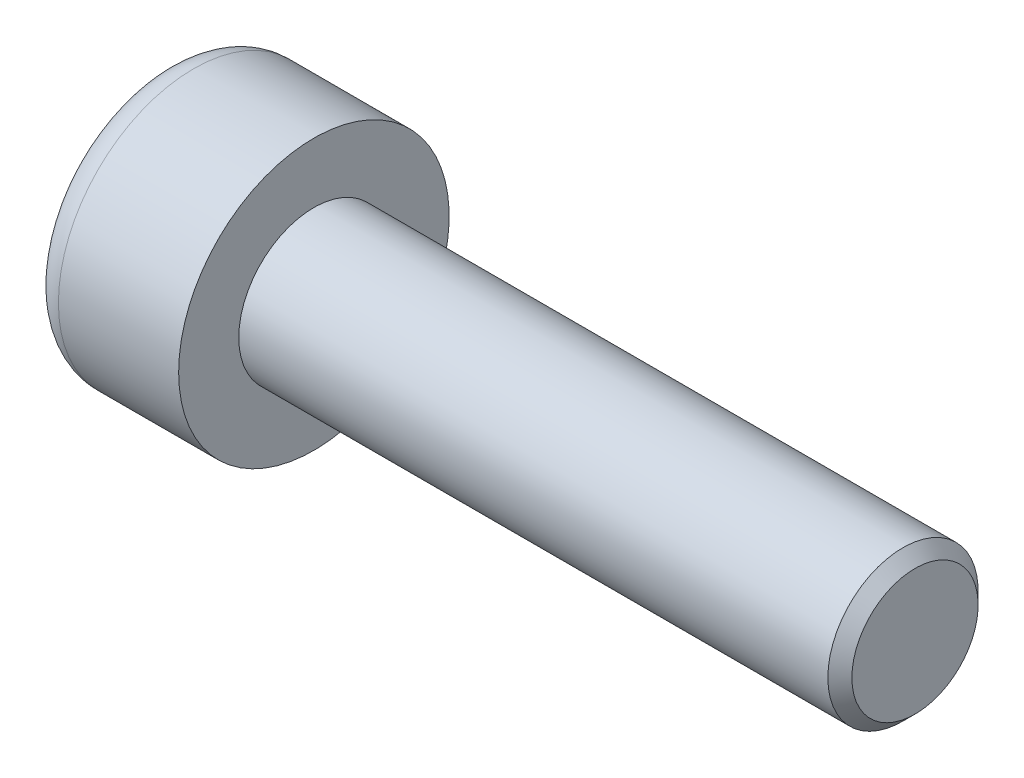
ISO-10303-21;
HEADER;
FILE_DESCRIPTION(('STEP AP214'),'2;1');
FILE_NAME('part.step','',(''),(''),'','','');
FILE_SCHEMA(('AUTOMOTIVE_DESIGN { 1 0 10303 214 1 1 1 1 }'));
ENDSEC;
DATA;
#1=APPLICATION_CONTEXT('core data for automotive mechanical design processes');
#2=APPLICATION_PROTOCOL_DEFINITION('international standard','automotive_design',2000,#1);
#3=PRODUCT_CONTEXT('',#1,'mechanical');
#4=PRODUCT('Part','Part','',(#3));
#5=PRODUCT_RELATED_PRODUCT_CATEGORY('part','',(#4));
#6=PRODUCT_DEFINITION_FORMATION('','',#4);
#7=PRODUCT_DEFINITION_CONTEXT('part definition',#1,'design');
#8=PRODUCT_DEFINITION('design','',#6,#7);
#9=PRODUCT_DEFINITION_SHAPE('','',#8);
#10=(LENGTH_UNIT() NAMED_UNIT(*) SI_UNIT(.MILLI.,.METRE.));
#11=(NAMED_UNIT(*) PLANE_ANGLE_UNIT() SI_UNIT($,.RADIAN.));
#12=(NAMED_UNIT(*) SI_UNIT($,.STERADIAN.) SOLID_ANGLE_UNIT());
#13=UNCERTAINTY_MEASURE_WITH_UNIT(LENGTH_MEASURE(1.E-05),#10,'distance_accuracy_value','');
#14=(GEOMETRIC_REPRESENTATION_CONTEXT(3) GLOBAL_UNCERTAINTY_ASSIGNED_CONTEXT((#13)) GLOBAL_UNIT_ASSIGNED_CONTEXT((#10,
#11,#12)) REPRESENTATION_CONTEXT('',''));
#15=CARTESIAN_POINT('',(0.,0.,0.));
#16=DIRECTION('',(0.,0.,1.));
#17=DIRECTION('',(1.,0.,0.));
#18=AXIS2_PLACEMENT_3D('',#15,#16,#17);
#19=CARTESIAN_POINT('',(10.,1.25,0.));
#20=DIRECTION('',(-1.,0.,0.));
#21=DIRECTION('',(0.,0.,1.));
#22=AXIS2_PLACEMENT_3D('',#19,#20,#21);
#23=PLANE('',#22);
#24=CARTESIAN_POINT('',(10.,0.,0.));
#25=DIRECTION('',(-1.,0.,0.));
#26=DIRECTION('',(0.,0.,1.));
#27=AXIS2_PLACEMENT_3D('',#24,#25,#26);
#28=CIRCLE('',#27,1.05000000000001);
#29=CARTESIAN_POINT('',(10.,0.,1.05000000000001));
#30=VERTEX_POINT('',#29);
#31=EDGE_CURVE('E149',#30,#30,#28,.F.);
#32=ORIENTED_EDGE('',*,*,#31,.T.);
#33=EDGE_LOOP('',(#32));
#34=FACE_BOUND('',#33,.T.);
#35=ADVANCED_FACE('F32',(#34),#23,.F.);
#36=CARTESIAN_POINT('',(-28.9826848249027,0.,0.));
#37=DIRECTION('',(-1.,0.,0.));
#38=DIRECTION('',(0.,0.,1.));
#39=AXIS2_PLACEMENT_3D('',#36,#37,#38);
#40=CYLINDRICAL_SURFACE('',#39,1.25);
#41=CARTESIAN_POINT('',(9.8,0.,0.));
#42=DIRECTION('',(-1.,0.,0.));
#43=DIRECTION('',(0.,0.,1.));
#44=AXIS2_PLACEMENT_3D('',#41,#42,#43);
#45=CIRCLE('',#44,1.25);
#46=CARTESIAN_POINT('',(9.8,0.,1.25));
#47=VERTEX_POINT('',#46);
#48=EDGE_CURVE('E146',#47,#47,#45,.T.);
#49=ORIENTED_EDGE('',*,*,#48,.T.);
#50=EDGE_LOOP('',(#49));
#51=FACE_BOUND('',#50,.T.);
#52=CARTESIAN_POINT('',(0.,0.,0.));
#53=DIRECTION('',(-1.,0.,0.));
#54=DIRECTION('',(0.,0.,1.));
#55=AXIS2_PLACEMENT_3D('',#52,#53,#54);
#56=CIRCLE('',#55,1.25);
#57=CARTESIAN_POINT('',(0.,0.,1.25));
#58=VERTEX_POINT('',#57);
#59=EDGE_CURVE('E143',#58,#58,#56,.T.);
#60=ORIENTED_EDGE('',*,*,#59,.F.);
#61=EDGE_LOOP('',(#60));
#62=FACE_BOUND('',#61,.T.);
#63=ADVANCED_FACE('F170',(#51,#62),#40,.T.);
#64=CARTESIAN_POINT('',(0.,2.25,0.));
#65=DIRECTION('',(-1.,0.,0.));
#66=DIRECTION('',(0.,0.,1.));
#67=AXIS2_PLACEMENT_3D('',#64,#65,#66);
#68=PLANE('',#67);
#69=CARTESIAN_POINT('',(0.,0.,0.));
#70=DIRECTION('',(-1.,0.,0.));
#71=DIRECTION('',(0.,0.,1.));
#72=AXIS2_PLACEMENT_3D('',#69,#70,#71);
#73=CIRCLE('',#72,2.25);
#74=CARTESIAN_POINT('',(0.,0.,2.25));
#75=VERTEX_POINT('',#74);
#76=EDGE_CURVE('E134',#75,#75,#73,.T.);
#77=ORIENTED_EDGE('',*,*,#76,.F.);
#78=EDGE_LOOP('',(#77));
#79=FACE_BOUND('',#78,.T.);
#80=ORIENTED_EDGE('',*,*,#59,.T.);
#81=EDGE_LOOP('',(#80));
#82=FACE_BOUND('',#81,.T.);
#83=ADVANCED_FACE('F175',(#79,#82),#68,.F.);
#84=CARTESIAN_POINT('',(-28.9826848249027,0.,0.));
#85=DIRECTION('',(-1.,0.,0.));
#86=DIRECTION('',(0.,0.,1.));
#87=AXIS2_PLACEMENT_3D('',#84,#85,#86);
#88=CYLINDRICAL_SURFACE('',#87,2.25);
#89=CARTESIAN_POINT('',(-2.,0.,0.));
#90=DIRECTION('',(1.,0.,0.));
#91=DIRECTION('',(0.,0.,-1.));
#92=AXIS2_PLACEMENT_3D('',#89,#90,#91);
#93=CIRCLE('',#92,2.25);
#94=CARTESIAN_POINT('',(-2.,0.,-2.25));
#95=VERTEX_POINT('',#94);
#96=EDGE_CURVE('E11',#95,#95,#93,.T.);
#97=ORIENTED_EDGE('',*,*,#96,.T.);
#98=EDGE_LOOP('',(#97));
#99=FACE_BOUND('',#98,.T.);
#100=ORIENTED_EDGE('',*,*,#76,.T.);
#101=EDGE_LOOP('',(#100));
#102=FACE_BOUND('',#101,.T.);
#103=ADVANCED_FACE('F184',(#99,#102),#88,.T.);
#104=CARTESIAN_POINT('',(-2.5,0.,0.));
#105=DIRECTION('',(1.,0.,0.));
#106=DIRECTION('',(0.,0.,-1.));
#107=AXIS2_PLACEMENT_3D('',#104,#105,#106);
#108=PLANE('',#107);
#109=DIRECTION('',(0.,0.86602540378444,-0.499999999999998));
#110=VECTOR('',#109,1.);
#111=CARTESIAN_POINT('',(-2.5,1.,0.577350269189627));
#112=LINE('',#111,#110);
#113=CARTESIAN_POINT('',(-2.5,0.,1.15470053837925));
#114=VERTEX_POINT('',#113);
#115=CARTESIAN_POINT('',(-2.5,1.,0.577350269189627));
#116=VERTEX_POINT('',#115);
#117=EDGE_CURVE('E100',#114,#116,#112,.T.);
#118=ORIENTED_EDGE('',*,*,#117,.F.);
#119=DIRECTION('',(0.,0.86602540378444,0.499999999999998));
#120=VECTOR('',#119,1.);
#121=CARTESIAN_POINT('',(-2.5,0.,1.15470053837925));
#122=LINE('',#121,#120);
#123=CARTESIAN_POINT('',(-2.5,-1.,0.577350269189627));
#124=VERTEX_POINT('',#123);
#125=EDGE_CURVE('E46',#124,#114,#122,.T.);
#126=ORIENTED_EDGE('',*,*,#125,.F.);
#127=DIRECTION('',(0.,0.,1.));
#128=VECTOR('',#127,1.);
#129=CARTESIAN_POINT('',(-2.5,-1.,0.577350269189627));
#130=LINE('',#129,#128);
#131=CARTESIAN_POINT('',(-2.5,-1.,-0.577350269189627));
#132=VERTEX_POINT('',#131);
#133=EDGE_CURVE('E116',#132,#124,#130,.T.);
#134=ORIENTED_EDGE('',*,*,#133,.F.);
#135=DIRECTION('',(0.,-0.86602540378444,0.499999999999998));
#136=VECTOR('',#135,1.);
#137=CARTESIAN_POINT('',(-2.5,-1.,-0.577350269189627));
#138=LINE('',#137,#136);
#139=CARTESIAN_POINT('',(-2.5,0.,-1.15470053837925));
#140=VERTEX_POINT('',#139);
#141=EDGE_CURVE('E110',#140,#132,#138,.T.);
#142=ORIENTED_EDGE('',*,*,#141,.F.);
#143=DIRECTION('',(0.,-0.86602540378444,-0.499999999999998));
#144=VECTOR('',#143,1.);
#145=CARTESIAN_POINT('',(-2.5,0.,-1.15470053837925));
#146=LINE('',#145,#144);
#147=CARTESIAN_POINT('',(-2.5,1.,-0.577350269189627));
#148=VERTEX_POINT('',#147);
#149=EDGE_CURVE('E108',#148,#140,#146,.T.);
#150=ORIENTED_EDGE('',*,*,#149,.F.);
#151=DIRECTION('',(0.,0.,-1.));
#152=VECTOR('',#151,1.);
#153=CARTESIAN_POINT('',(-2.5,1.,-0.577350269189627));
#154=LINE('',#153,#152);
#155=EDGE_CURVE('E89',#116,#148,#154,.T.);
#156=ORIENTED_EDGE('',*,*,#155,.F.);
#157=EDGE_LOOP('',(#118,#126,#134,#142,#150,#156));
#158=FACE_BOUND('',#157,.T.);
#159=CARTESIAN_POINT('',(-2.5,0.,0.));
#160=DIRECTION('',(1.,0.,0.));
#161=DIRECTION('',(0.,0.,-1.));
#162=AXIS2_PLACEMENT_3D('',#159,#160,#161);
#163=CIRCLE('',#162,1.75);
#164=CARTESIAN_POINT('',(-2.5,0.,-1.75));
#165=VERTEX_POINT('',#164);
#166=EDGE_CURVE('E39',#165,#165,#163,.F.);
#167=ORIENTED_EDGE('',*,*,#166,.T.);
#168=EDGE_LOOP('',(#167));
#169=FACE_BOUND('',#168,.T.);
#170=ADVANCED_FACE('F104',(#158,#169),#108,.F.);
#171=CARTESIAN_POINT('',(9.8,0.,0.));
#172=DIRECTION('',(-1.,0.,0.));
#173=DIRECTION('',(0.,0.,1.));
#174=AXIS2_PLACEMENT_3D('',#171,#172,#173);
#175=CONICAL_SURFACE('',#174,1.25,0.785398163397442);
#176=ORIENTED_EDGE('',*,*,#31,.F.);
#177=EDGE_LOOP('',(#176));
#178=FACE_BOUND('',#177,.T.);
#179=ORIENTED_EDGE('',*,*,#48,.F.);
#180=EDGE_LOOP('',(#179));
#181=FACE_BOUND('',#180,.T.);
#182=ADVANCED_FACE('F157',(#178,#181),#175,.T.);
#183=CARTESIAN_POINT('',(-2.,0.,0.));
#184=DIRECTION('',(1.,0.,0.));
#185=DIRECTION('',(0.,0.,-1.));
#186=AXIS2_PLACEMENT_3D('',#183,#184,#185);
#187=TOROIDAL_SURFACE('',#186,1.75,0.5);
#188=ORIENTED_EDGE('',*,*,#96,.F.);
#189=EDGE_LOOP('',(#188));
#190=FACE_BOUND('',#189,.T.);
#191=ORIENTED_EDGE('',*,*,#166,.F.);
#192=EDGE_LOOP('',(#191));
#193=FACE_BOUND('',#192,.T.);
#194=ADVANCED_FACE('F154',(#190,#193),#187,.T.);
#195=CARTESIAN_POINT('',(0.,0.,1.15470053837925));
#196=DIRECTION('',(0.,-0.499999999999998,0.86602540378444));
#197=DIRECTION('',(0.,-0.86602540378444,-0.499999999999998));
#198=AXIS2_PLACEMENT_3D('',#195,#196,#197);
#199=PLANE('',#198);
#200=ORIENTED_EDGE('',*,*,#125,.T.);
#201=DIRECTION('',(-1.,0.,0.));
#202=VECTOR('',#201,1.);
#203=CARTESIAN_POINT('',(0.,0.,1.15470053837925));
#204=LINE('',#203,#202);
#205=CARTESIAN_POINT('',(0.,0.,1.15470053837925));
#206=VERTEX_POINT('',#205);
#207=EDGE_CURVE('E97',#206,#114,#204,.T.);
#208=ORIENTED_EDGE('',*,*,#207,.F.);
#209=DIRECTION('',(0.,0.86602540378444,0.499999999999998));
#210=VECTOR('',#209,1.);
#211=CARTESIAN_POINT('',(0.,0.,1.15470053837925));
#212=LINE('',#211,#210);
#213=CARTESIAN_POINT('',(0.,-1.,0.577350269189627));
#214=VERTEX_POINT('',#213);
#215=EDGE_CURVE('E118',#214,#206,#212,.T.);
#216=ORIENTED_EDGE('',*,*,#215,.F.);
#217=DIRECTION('',(-1.,0.,0.));
#218=VECTOR('',#217,1.);
#219=CARTESIAN_POINT('',(0.,-1.,0.577350269189627));
#220=LINE('',#219,#218);
#221=EDGE_CURVE('E53',#214,#124,#220,.T.);
#222=ORIENTED_EDGE('',*,*,#221,.T.);
#223=EDGE_LOOP('',(#200,#208,#216,#222));
#224=FACE_BOUND('',#223,.T.);
#225=ADVANCED_FACE('F156',(#224),#199,.F.);
#226=CARTESIAN_POINT('',(0.,-1.,0.577350269189627));
#227=DIRECTION('',(0.,-1.,0.));
#228=DIRECTION('',(0.,0.,-1.));
#229=AXIS2_PLACEMENT_3D('',#226,#227,#228);
#230=PLANE('',#229);
#231=ORIENTED_EDGE('',*,*,#133,.T.);
#232=ORIENTED_EDGE('',*,*,#221,.F.);
#233=DIRECTION('',(0.,0.,1.));
#234=VECTOR('',#233,1.);
#235=CARTESIAN_POINT('',(0.,-1.,0.577350269189627));
#236=LINE('',#235,#234);
#237=CARTESIAN_POINT('',(0.,-1.,-0.577350269189627));
#238=VERTEX_POINT('',#237);
#239=EDGE_CURVE('E130',#238,#214,#236,.T.);
#240=ORIENTED_EDGE('',*,*,#239,.F.);
#241=DIRECTION('',(-1.,0.,0.));
#242=VECTOR('',#241,1.);
#243=CARTESIAN_POINT('',(0.,-1.,-0.577350269189627));
#244=LINE('',#243,#242);
#245=EDGE_CURVE('E135',#238,#132,#244,.T.);
#246=ORIENTED_EDGE('',*,*,#245,.T.);
#247=EDGE_LOOP('',(#231,#232,#240,#246));
#248=FACE_BOUND('',#247,.T.);
#249=ADVANCED_FACE('F164',(#248),#230,.F.);
#250=CARTESIAN_POINT('',(0.,-1.,-0.577350269189627));
#251=DIRECTION('',(0.,-0.499999999999998,-0.86602540378444));
#252=DIRECTION('',(0.,0.86602540378444,-0.499999999999998));
#253=AXIS2_PLACEMENT_3D('',#250,#251,#252);
#254=PLANE('',#253);
#255=ORIENTED_EDGE('',*,*,#141,.T.);
#256=ORIENTED_EDGE('',*,*,#245,.F.);
#257=DIRECTION('',(0.,-0.86602540378444,0.499999999999998));
#258=VECTOR('',#257,1.);
#259=CARTESIAN_POINT('',(0.,-1.,-0.577350269189627));
#260=LINE('',#259,#258);
#261=CARTESIAN_POINT('',(0.,0.,-1.15470053837925));
#262=VERTEX_POINT('',#261);
#263=EDGE_CURVE('E127',#262,#238,#260,.T.);
#264=ORIENTED_EDGE('',*,*,#263,.F.);
#265=DIRECTION('',(-1.,0.,0.));
#266=VECTOR('',#265,1.);
#267=CARTESIAN_POINT('',(0.,0.,-1.15470053837925));
#268=LINE('',#267,#266);
#269=EDGE_CURVE('E137',#262,#140,#268,.T.);
#270=ORIENTED_EDGE('',*,*,#269,.T.);
#271=EDGE_LOOP('',(#255,#256,#264,#270));
#272=FACE_BOUND('',#271,.T.);
#273=ADVANCED_FACE('F230',(#272),#254,.F.);
#274=CARTESIAN_POINT('',(0.,0.,-1.15470053837925));
#275=DIRECTION('',(0.,0.499999999999998,-0.86602540378444));
#276=DIRECTION('',(0.,0.86602540378444,0.499999999999998));
#277=AXIS2_PLACEMENT_3D('',#274,#275,#276);
#278=PLANE('',#277);
#279=ORIENTED_EDGE('',*,*,#149,.T.);
#280=ORIENTED_EDGE('',*,*,#269,.F.);
#281=DIRECTION('',(0.,-0.86602540378444,-0.499999999999998));
#282=VECTOR('',#281,1.);
#283=CARTESIAN_POINT('',(0.,0.,-1.15470053837925));
#284=LINE('',#283,#282);
#285=CARTESIAN_POINT('',(0.,1.,-0.577350269189627));
#286=VERTEX_POINT('',#285);
#287=EDGE_CURVE('E124',#286,#262,#284,.T.);
#288=ORIENTED_EDGE('',*,*,#287,.F.);
#289=DIRECTION('',(-1.,0.,0.));
#290=VECTOR('',#289,1.);
#291=CARTESIAN_POINT('',(0.,1.,-0.577350269189627));
#292=LINE('',#291,#290);
#293=EDGE_CURVE('E96',#286,#148,#292,.T.);
#294=ORIENTED_EDGE('',*,*,#293,.T.);
#295=EDGE_LOOP('',(#279,#280,#288,#294));
#296=FACE_BOUND('',#295,.T.);
#297=ADVANCED_FACE('F238',(#296),#278,.F.);
#298=CARTESIAN_POINT('',(0.,1.,-0.577350269189627));
#299=DIRECTION('',(0.,1.,0.));
#300=DIRECTION('',(0.,0.,1.));
#301=AXIS2_PLACEMENT_3D('',#298,#299,#300);
#302=PLANE('',#301);
#303=ORIENTED_EDGE('',*,*,#155,.T.);
#304=ORIENTED_EDGE('',*,*,#293,.F.);
#305=DIRECTION('',(0.,0.,-1.));
#306=VECTOR('',#305,1.);
#307=CARTESIAN_POINT('',(0.,1.,-0.577350269189627));
#308=LINE('',#307,#306);
#309=CARTESIAN_POINT('',(0.,1.,0.577350269189627));
#310=VERTEX_POINT('',#309);
#311=EDGE_CURVE('E92',#310,#286,#308,.T.);
#312=ORIENTED_EDGE('',*,*,#311,.F.);
#313=DIRECTION('',(-1.,0.,0.));
#314=VECTOR('',#313,1.);
#315=CARTESIAN_POINT('',(0.,1.,0.577350269189627));
#316=LINE('',#315,#314);
#317=EDGE_CURVE('E85',#310,#116,#316,.T.);
#318=ORIENTED_EDGE('',*,*,#317,.T.);
#319=EDGE_LOOP('',(#303,#304,#312,#318));
#320=FACE_BOUND('',#319,.T.);
#321=ADVANCED_FACE('F87',(#320),#302,.F.);
#322=CARTESIAN_POINT('',(0.,1.,0.577350269189627));
#323=DIRECTION('',(0.,0.499999999999998,0.86602540378444));
#324=DIRECTION('',(0.,-0.86602540378444,0.499999999999998));
#325=AXIS2_PLACEMENT_3D('',#322,#323,#324);
#326=PLANE('',#325);
#327=ORIENTED_EDGE('',*,*,#117,.T.);
#328=ORIENTED_EDGE('',*,*,#317,.F.);
#329=DIRECTION('',(0.,0.86602540378444,-0.499999999999998));
#330=VECTOR('',#329,1.);
#331=CARTESIAN_POINT('',(0.,1.,0.577350269189627));
#332=LINE('',#331,#330);
#333=EDGE_CURVE('E121',#206,#310,#332,.T.);
#334=ORIENTED_EDGE('',*,*,#333,.F.);
#335=ORIENTED_EDGE('',*,*,#207,.T.);
#336=EDGE_LOOP('',(#327,#328,#334,#335));
#337=FACE_BOUND('',#336,.T.);
#338=ADVANCED_FACE('F101',(#337),#326,.F.);
#339=CARTESIAN_POINT('',(0.,-1.,0.577350269189627));
#340=DIRECTION('',(1.,0.,0.));
#341=DIRECTION('',(0.,0.,-1.));
#342=AXIS2_PLACEMENT_3D('',#339,#340,#341);
#343=PLANE('',#342);
#344=ORIENTED_EDGE('',*,*,#215,.T.);
#345=ORIENTED_EDGE('',*,*,#333,.T.);
#346=ORIENTED_EDGE('',*,*,#311,.T.);
#347=ORIENTED_EDGE('',*,*,#287,.T.);
#348=ORIENTED_EDGE('',*,*,#263,.T.);
#349=ORIENTED_EDGE('',*,*,#239,.T.);
#350=EDGE_LOOP('',(#344,#345,#346,#347,#348,#349));
#351=FACE_BOUND('',#350,.T.);
#352=ADVANCED_FACE('F262',(#351),#343,.F.);
#353=CLOSED_SHELL('',(#35,#63,#83,#103,#170,#182,#194,#225,#249,#273,#297,#321,#338,#352));
#354=MANIFOLD_SOLID_BREP('B2',#353);
#355=ADVANCED_BREP_SHAPE_REPRESENTATION('',(#18,#354),#14);
#356=SHAPE_DEFINITION_REPRESENTATION(#9,#355);
ENDSEC;
END-ISO-10303-21;
